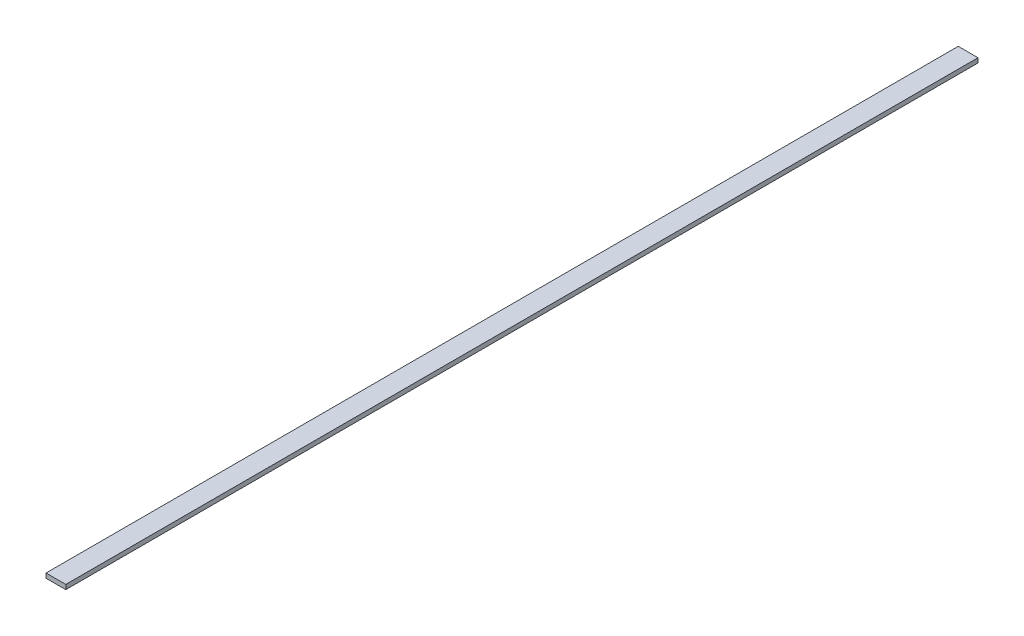
ISO-10303-21;
HEADER;
FILE_DESCRIPTION(('STEP AP214'),'2;1');
FILE_NAME('part.step','',(''),(''),'','','');
FILE_SCHEMA(('AUTOMOTIVE_DESIGN { 1 0 10303 214 1 1 1 1 }'));
ENDSEC;
DATA;
#1=APPLICATION_CONTEXT('core data for automotive mechanical design processes');
#2=APPLICATION_PROTOCOL_DEFINITION('international standard','automotive_design',2000,#1);
#3=PRODUCT_CONTEXT('',#1,'mechanical');
#4=PRODUCT('Part','Part','',(#3));
#5=PRODUCT_RELATED_PRODUCT_CATEGORY('part','',(#4));
#6=PRODUCT_DEFINITION_FORMATION('','',#4);
#7=PRODUCT_DEFINITION_CONTEXT('part definition',#1,'design');
#8=PRODUCT_DEFINITION('design','',#6,#7);
#9=PRODUCT_DEFINITION_SHAPE('','',#8);
#10=(LENGTH_UNIT() NAMED_UNIT(*) SI_UNIT(.MILLI.,.METRE.));
#11=(NAMED_UNIT(*) PLANE_ANGLE_UNIT() SI_UNIT($,.RADIAN.));
#12=(NAMED_UNIT(*) SI_UNIT($,.STERADIAN.) SOLID_ANGLE_UNIT());
#13=UNCERTAINTY_MEASURE_WITH_UNIT(LENGTH_MEASURE(1.E-05),#10,'distance_accuracy_value','');
#14=(GEOMETRIC_REPRESENTATION_CONTEXT(3) GLOBAL_UNCERTAINTY_ASSIGNED_CONTEXT((#13)) GLOBAL_UNIT_ASSIGNED_CONTEXT((#10,
#11,#12)) REPRESENTATION_CONTEXT('',''));
#15=CARTESIAN_POINT('',(0.,0.,0.));
#16=DIRECTION('',(0.,0.,1.));
#17=DIRECTION('',(1.,0.,0.));
#18=AXIS2_PLACEMENT_3D('',#15,#16,#17);
#19=CARTESIAN_POINT('',(3.25,0.750000000000001,300.));
#20=DIRECTION('',(-1.,0.,0.));
#21=DIRECTION('',(0.,0.,1.));
#22=AXIS2_PLACEMENT_3D('',#19,#20,#21);
#23=PLANE('',#22);
#24=DIRECTION('',(0.,1.,0.));
#25=VECTOR('',#24,1.);
#26=CARTESIAN_POINT('',(3.25,0.750000000000001,0.));
#27=LINE('',#26,#25);
#28=CARTESIAN_POINT('',(3.25,-0.749999999999999,0.));
#29=VERTEX_POINT('',#28);
#30=CARTESIAN_POINT('',(3.25,0.750000000000001,0.));
#31=VERTEX_POINT('',#30);
#32=EDGE_CURVE('E96',#29,#31,#27,.T.);
#33=ORIENTED_EDGE('',*,*,#32,.T.);
#34=DIRECTION('',(0.,0.,-1.));
#35=VECTOR('',#34,1.);
#36=CARTESIAN_POINT('',(3.25,0.750000000000001,300.));
#37=LINE('',#36,#35);
#38=CARTESIAN_POINT('',(3.25,0.750000000000001,300.));
#39=VERTEX_POINT('',#38);
#40=EDGE_CURVE('E11',#39,#31,#37,.T.);
#41=ORIENTED_EDGE('',*,*,#40,.F.);
#42=DIRECTION('',(0.,1.,0.));
#43=VECTOR('',#42,1.);
#44=CARTESIAN_POINT('',(3.25,0.750000000000001,300.));
#45=LINE('',#44,#43);
#46=CARTESIAN_POINT('',(3.25,-0.749999999999999,300.));
#47=VERTEX_POINT('',#46);
#48=EDGE_CURVE('E84',#47,#39,#45,.T.);
#49=ORIENTED_EDGE('',*,*,#48,.F.);
#50=DIRECTION('',(0.,0.,-1.));
#51=VECTOR('',#50,1.);
#52=CARTESIAN_POINT('',(3.25,-0.749999999999999,300.));
#53=LINE('',#52,#51);
#54=EDGE_CURVE('E92',#47,#29,#53,.T.);
#55=ORIENTED_EDGE('',*,*,#54,.T.);
#56=EDGE_LOOP('',(#33,#41,#49,#55));
#57=FACE_BOUND('',#56,.T.);
#58=ADVANCED_FACE('F33',(#57),#23,.F.);
#59=CARTESIAN_POINT('',(-3.25,0.750000000000001,300.));
#60=DIRECTION('',(0.,-1.,0.));
#61=DIRECTION('',(0.,0.,-1.));
#62=AXIS2_PLACEMENT_3D('',#59,#60,#61);
#63=PLANE('',#62);
#64=DIRECTION('',(-1.,0.,0.));
#65=VECTOR('',#64,1.);
#66=CARTESIAN_POINT('',(-3.25,0.750000000000001,0.));
#67=LINE('',#66,#65);
#68=CARTESIAN_POINT('',(-3.25,0.750000000000001,0.));
#69=VERTEX_POINT('',#68);
#70=EDGE_CURVE('E88',#31,#69,#67,.T.);
#71=ORIENTED_EDGE('',*,*,#70,.T.);
#72=DIRECTION('',(0.,0.,-1.));
#73=VECTOR('',#72,1.);
#74=CARTESIAN_POINT('',(-3.25,0.750000000000001,300.));
#75=LINE('',#74,#73);
#76=CARTESIAN_POINT('',(-3.25,0.750000000000001,300.));
#77=VERTEX_POINT('',#76);
#78=EDGE_CURVE('E41',#77,#69,#75,.T.);
#79=ORIENTED_EDGE('',*,*,#78,.F.);
#80=DIRECTION('',(-1.,0.,0.));
#81=VECTOR('',#80,1.);
#82=CARTESIAN_POINT('',(-3.25,0.750000000000001,300.));
#83=LINE('',#82,#81);
#84=EDGE_CURVE('E79',#39,#77,#83,.T.);
#85=ORIENTED_EDGE('',*,*,#84,.F.);
#86=ORIENTED_EDGE('',*,*,#40,.T.);
#87=EDGE_LOOP('',(#71,#79,#85,#86));
#88=FACE_BOUND('',#87,.T.);
#89=ADVANCED_FACE('F87',(#88),#63,.F.);
#90=CARTESIAN_POINT('',(-3.25,0.750000000000001,300.));
#91=DIRECTION('',(1.,0.,0.));
#92=DIRECTION('',(0.,0.,-1.));
#93=AXIS2_PLACEMENT_3D('',#90,#91,#92);
#94=PLANE('',#93);
#95=DIRECTION('',(0.,-1.,0.));
#96=VECTOR('',#95,1.);
#97=CARTESIAN_POINT('',(-3.25,0.750000000000001,0.));
#98=LINE('',#97,#96);
#99=CARTESIAN_POINT('',(-3.25,-0.749999999999999,0.));
#100=VERTEX_POINT('',#99);
#101=EDGE_CURVE('E66',#69,#100,#98,.T.);
#102=ORIENTED_EDGE('',*,*,#101,.T.);
#103=DIRECTION('',(0.,0.,-1.));
#104=VECTOR('',#103,1.);
#105=CARTESIAN_POINT('',(-3.25,-0.749999999999999,300.));
#106=LINE('',#105,#104);
#107=CARTESIAN_POINT('',(-3.25,-0.749999999999999,300.));
#108=VERTEX_POINT('',#107);
#109=EDGE_CURVE('E89',#108,#100,#106,.T.);
#110=ORIENTED_EDGE('',*,*,#109,.F.);
#111=DIRECTION('',(0.,-1.,0.));
#112=VECTOR('',#111,1.);
#113=CARTESIAN_POINT('',(-3.25,0.750000000000001,300.));
#114=LINE('',#113,#112);
#115=EDGE_CURVE('E82',#77,#108,#114,.T.);
#116=ORIENTED_EDGE('',*,*,#115,.F.);
#117=ORIENTED_EDGE('',*,*,#78,.T.);
#118=EDGE_LOOP('',(#102,#110,#116,#117));
#119=FACE_BOUND('',#118,.T.);
#120=ADVANCED_FACE('F90',(#119),#94,.F.);
#121=CARTESIAN_POINT('',(-3.25,-0.749999999999999,300.));
#122=DIRECTION('',(0.,1.,0.));
#123=DIRECTION('',(0.,0.,1.));
#124=AXIS2_PLACEMENT_3D('',#121,#122,#123);
#125=PLANE('',#124);
#126=DIRECTION('',(1.,0.,0.));
#127=VECTOR('',#126,1.);
#128=CARTESIAN_POINT('',(-3.25,-0.749999999999999,0.));
#129=LINE('',#128,#127);
#130=EDGE_CURVE('E72',#100,#29,#129,.T.);
#131=ORIENTED_EDGE('',*,*,#130,.T.);
#132=ORIENTED_EDGE('',*,*,#54,.F.);
#133=DIRECTION('',(1.,0.,0.));
#134=VECTOR('',#133,1.);
#135=CARTESIAN_POINT('',(-3.25,-0.749999999999999,300.));
#136=LINE('',#135,#134);
#137=EDGE_CURVE('E49',#108,#47,#136,.T.);
#138=ORIENTED_EDGE('',*,*,#137,.F.);
#139=ORIENTED_EDGE('',*,*,#109,.T.);
#140=EDGE_LOOP('',(#131,#132,#138,#139));
#141=FACE_BOUND('',#140,.T.);
#142=ADVANCED_FACE('F103',(#141),#125,.F.);
#143=CARTESIAN_POINT('',(0.,0.,300.));
#144=DIRECTION('',(0.,0.,1.));
#145=DIRECTION('',(1.,0.,0.));
#146=AXIS2_PLACEMENT_3D('',#143,#144,#145);
#147=PLANE('',#146);
#148=ORIENTED_EDGE('',*,*,#48,.T.);
#149=ORIENTED_EDGE('',*,*,#84,.T.);
#150=ORIENTED_EDGE('',*,*,#115,.T.);
#151=ORIENTED_EDGE('',*,*,#137,.T.);
#152=EDGE_LOOP('',(#148,#149,#150,#151));
#153=FACE_BOUND('',#152,.T.);
#154=ADVANCED_FACE('F80',(#153),#147,.T.);
#155=CARTESIAN_POINT('',(0.,0.,0.));
#156=DIRECTION('',(0.,0.,1.));
#157=DIRECTION('',(1.,0.,0.));
#158=AXIS2_PLACEMENT_3D('',#155,#156,#157);
#159=PLANE('',#158);
#160=ORIENTED_EDGE('',*,*,#32,.F.);
#161=ORIENTED_EDGE('',*,*,#130,.F.);
#162=ORIENTED_EDGE('',*,*,#101,.F.);
#163=ORIENTED_EDGE('',*,*,#70,.F.);
#164=EDGE_LOOP('',(#160,#161,#162,#163));
#165=FACE_BOUND('',#164,.T.);
#166=ADVANCED_FACE('F106',(#165),#159,.F.);
#167=CLOSED_SHELL('',(#58,#89,#120,#142,#154,#166));
#168=MANIFOLD_SOLID_BREP('B2',#167);
#169=ADVANCED_BREP_SHAPE_REPRESENTATION('',(#18,#168),#14);
#170=SHAPE_DEFINITION_REPRESENTATION(#9,#169);
ENDSEC;
END-ISO-10303-21;
